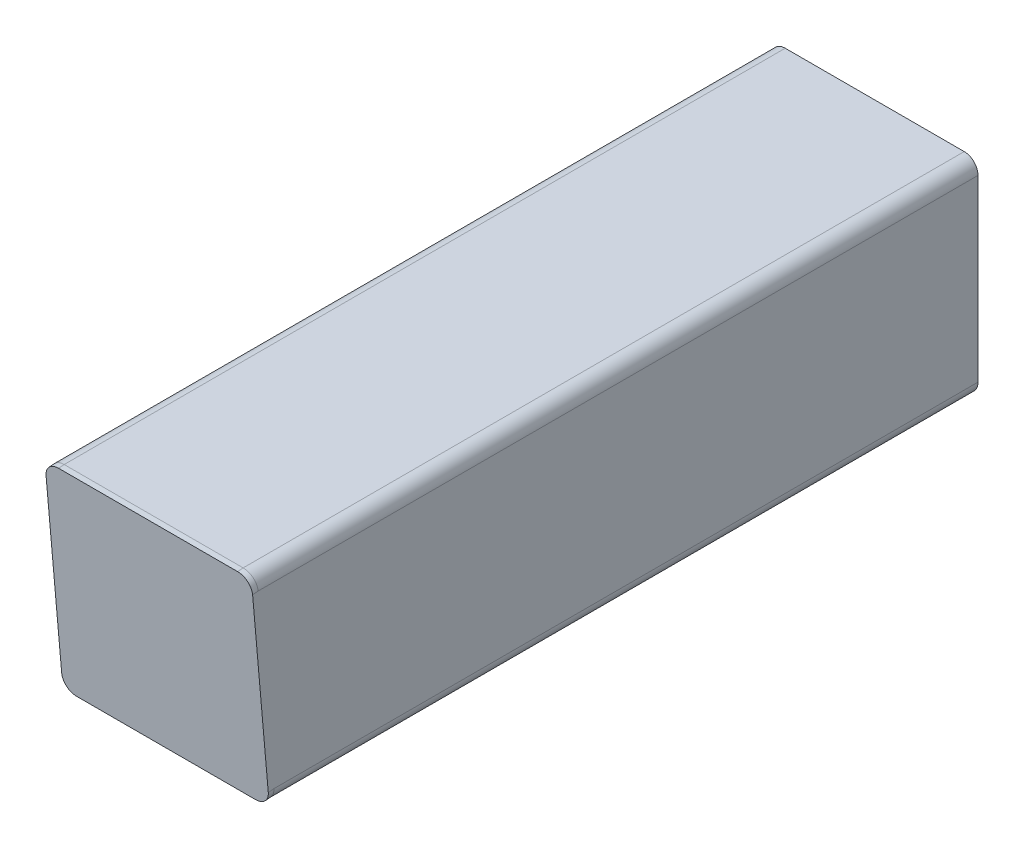
ISO-10303-21;
HEADER;
FILE_DESCRIPTION(('STEP AP214'),'2;1');
FILE_NAME('part.step','',(''),(''),'','','');
FILE_SCHEMA(('AUTOMOTIVE_DESIGN { 1 0 10303 214 1 1 1 1 }'));
ENDSEC;
DATA;
#1=APPLICATION_CONTEXT('core data for automotive mechanical design processes');
#2=APPLICATION_PROTOCOL_DEFINITION('international standard','automotive_design',2000,#1);
#3=PRODUCT_CONTEXT('',#1,'mechanical');
#4=PRODUCT('Part','Part','',(#3));
#5=PRODUCT_RELATED_PRODUCT_CATEGORY('part','',(#4));
#6=PRODUCT_DEFINITION_FORMATION('','',#4);
#7=PRODUCT_DEFINITION_CONTEXT('part definition',#1,'design');
#8=PRODUCT_DEFINITION('design','',#6,#7);
#9=PRODUCT_DEFINITION_SHAPE('','',#8);
#10=(LENGTH_UNIT() NAMED_UNIT(*) SI_UNIT(.MILLI.,.METRE.));
#11=(NAMED_UNIT(*) PLANE_ANGLE_UNIT() SI_UNIT($,.RADIAN.));
#12=(NAMED_UNIT(*) SI_UNIT($,.STERADIAN.) SOLID_ANGLE_UNIT());
#13=UNCERTAINTY_MEASURE_WITH_UNIT(LENGTH_MEASURE(1.E-05),#10,'distance_accuracy_value','');
#14=(GEOMETRIC_REPRESENTATION_CONTEXT(3) GLOBAL_UNCERTAINTY_ASSIGNED_CONTEXT((#13)) GLOBAL_UNIT_ASSIGNED_CONTEXT((#10,
#11,#12)) REPRESENTATION_CONTEXT('',''));
#15=CARTESIAN_POINT('',(0.,0.,0.));
#16=DIRECTION('',(0.,0.,1.));
#17=DIRECTION('',(1.,0.,0.));
#18=AXIS2_PLACEMENT_3D('',#15,#16,#17);
#19=CARTESIAN_POINT('',(2.54,-35.56,0.));
#20=DIRECTION('',(0.,0.,1.));
#21=DIRECTION('',(1.,0.,0.));
#22=AXIS2_PLACEMENT_3D('',#19,#20,#21);
#23=PLANE('',#22);
#24=CARTESIAN_POINT('',(2.54,-35.56,0.));
#25=DIRECTION('',(0.,0.,1.));
#26=DIRECTION('',(1.,0.,0.));
#27=AXIS2_PLACEMENT_3D('',#24,#25,#26);
#28=CIRCLE('',#27,2.54);
#29=CARTESIAN_POINT('',(0.,-35.56,0.));
#30=VERTEX_POINT('',#29);
#31=CARTESIAN_POINT('',(2.54000000000002,-38.1,0.));
#32=VERTEX_POINT('',#31);
#33=EDGE_CURVE('E358',#30,#32,#28,.T.);
#34=ORIENTED_EDGE('',*,*,#33,.F.);
#35=DIRECTION('',(0.,-1.,0.));
#36=VECTOR('',#35,1.);
#37=CARTESIAN_POINT('',(0.,-2.54000000000002,0.));
#38=LINE('',#37,#36);
#39=CARTESIAN_POINT('',(0.,-2.54000000000002,0.));
#40=VERTEX_POINT('',#39);
#41=EDGE_CURVE('E342',#40,#30,#38,.T.);
#42=ORIENTED_EDGE('',*,*,#41,.F.);
#43=CARTESIAN_POINT('',(2.54,-2.54,0.));
#44=DIRECTION('',(0.,0.,1.));
#45=DIRECTION('',(-1.,0.,0.));
#46=AXIS2_PLACEMENT_3D('',#43,#44,#45);
#47=CIRCLE('',#46,2.54);
#48=CARTESIAN_POINT('',(2.54000000000002,0.,0.));
#49=VERTEX_POINT('',#48);
#50=EDGE_CURVE('E345',#49,#40,#47,.T.);
#51=ORIENTED_EDGE('',*,*,#50,.F.);
#52=DIRECTION('',(-1.,0.,0.));
#53=VECTOR('',#52,1.);
#54=CARTESIAN_POINT('',(2.54000000000002,0.,0.));
#55=LINE('',#54,#53);
#56=CARTESIAN_POINT('',(35.56,0.,0.));
#57=VERTEX_POINT('',#56);
#58=EDGE_CURVE('E348',#57,#49,#55,.T.);
#59=ORIENTED_EDGE('',*,*,#58,.F.);
#60=CARTESIAN_POINT('',(35.56,-2.54,0.));
#61=DIRECTION('',(0.,0.,1.));
#62=DIRECTION('',(1.,0.,0.));
#63=AXIS2_PLACEMENT_3D('',#60,#61,#62);
#64=CIRCLE('',#63,2.54);
#65=CARTESIAN_POINT('',(38.1,-2.54000000000002,0.));
#66=VERTEX_POINT('',#65);
#67=EDGE_CURVE('E350',#66,#57,#64,.T.);
#68=ORIENTED_EDGE('',*,*,#67,.F.);
#69=DIRECTION('',(0.,1.,0.));
#70=VECTOR('',#69,1.);
#71=CARTESIAN_POINT('',(38.1,-2.54000000000002,0.));
#72=LINE('',#71,#70);
#73=CARTESIAN_POINT('',(38.1,-35.56,0.));
#74=VERTEX_POINT('',#73);
#75=EDGE_CURVE('E352',#74,#66,#72,.T.);
#76=ORIENTED_EDGE('',*,*,#75,.F.);
#77=CARTESIAN_POINT('',(35.56,-35.56,0.));
#78=DIRECTION('',(0.,0.,1.));
#79=DIRECTION('',(-1.,0.,0.));
#80=AXIS2_PLACEMENT_3D('',#77,#78,#79);
#81=CIRCLE('',#80,2.54);
#82=CARTESIAN_POINT('',(35.56,-38.1,0.));
#83=VERTEX_POINT('',#82);
#84=EDGE_CURVE('E355',#83,#74,#81,.T.);
#85=ORIENTED_EDGE('',*,*,#84,.F.);
#86=DIRECTION('',(1.,0.,0.));
#87=VECTOR('',#86,1.);
#88=CARTESIAN_POINT('',(2.54000000000002,-38.1,0.));
#89=LINE('',#88,#87);
#90=EDGE_CURVE('E321',#32,#83,#89,.T.);
#91=ORIENTED_EDGE('',*,*,#90,.F.);
#92=EDGE_LOOP('',(#34,#42,#51,#59,#68,#76,#85,#91));
#93=FACE_BOUND('',#92,.T.);
#94=CARTESIAN_POINT('',(5.3086,-32.7914,0.));
#95=DIRECTION('',(0.,0.,1.));
#96=DIRECTION('',(1.,0.,0.));
#97=AXIS2_PLACEMENT_3D('',#94,#95,#96);
#98=CIRCLE('',#97,2.54);
#99=CARTESIAN_POINT('',(2.7686,-32.7914,0.));
#100=VERTEX_POINT('',#99);
#101=CARTESIAN_POINT('',(5.30860000000002,-35.3314,0.));
#102=VERTEX_POINT('',#101);
#103=EDGE_CURVE('E400',#100,#102,#98,.T.);
#104=ORIENTED_EDGE('',*,*,#103,.T.);
#105=DIRECTION('',(1.,0.,0.));
#106=VECTOR('',#105,1.);
#107=CARTESIAN_POINT('',(5.30860000000002,-35.3314,0.));
#108=LINE('',#107,#106);
#109=CARTESIAN_POINT('',(32.7914,-35.3314,0.));
#110=VERTEX_POINT('',#109);
#111=EDGE_CURVE('E397',#102,#110,#108,.T.);
#112=ORIENTED_EDGE('',*,*,#111,.T.);
#113=CARTESIAN_POINT('',(32.7914,-32.7914,0.));
#114=DIRECTION('',(0.,0.,1.));
#115=DIRECTION('',(1.,0.,0.));
#116=AXIS2_PLACEMENT_3D('',#113,#114,#115);
#117=CIRCLE('',#116,2.54);
#118=CARTESIAN_POINT('',(35.3314,-32.7914,0.));
#119=VERTEX_POINT('',#118);
#120=EDGE_CURVE('E394',#110,#119,#117,.T.);
#121=ORIENTED_EDGE('',*,*,#120,.T.);
#122=DIRECTION('',(0.,1.,0.));
#123=VECTOR('',#122,1.);
#124=CARTESIAN_POINT('',(35.3314,-5.30860000000002,0.));
#125=LINE('',#124,#123);
#126=CARTESIAN_POINT('',(35.3314,-5.30860000000002,0.));
#127=VERTEX_POINT('',#126);
#128=EDGE_CURVE('E391',#119,#127,#125,.T.);
#129=ORIENTED_EDGE('',*,*,#128,.T.);
#130=CARTESIAN_POINT('',(32.7914,-5.3086,0.));
#131=DIRECTION('',(0.,0.,1.));
#132=DIRECTION('',(1.,0.,0.));
#133=AXIS2_PLACEMENT_3D('',#130,#131,#132);
#134=CIRCLE('',#133,2.54);
#135=CARTESIAN_POINT('',(32.7914,-2.7686,0.));
#136=VERTEX_POINT('',#135);
#137=EDGE_CURVE('E388',#127,#136,#134,.T.);
#138=ORIENTED_EDGE('',*,*,#137,.T.);
#139=DIRECTION('',(-1.,0.,0.));
#140=VECTOR('',#139,1.);
#141=CARTESIAN_POINT('',(5.30860000000002,-2.7686,0.));
#142=LINE('',#141,#140);
#143=CARTESIAN_POINT('',(5.30860000000002,-2.7686,0.));
#144=VERTEX_POINT('',#143);
#145=EDGE_CURVE('E385',#136,#144,#142,.T.);
#146=ORIENTED_EDGE('',*,*,#145,.T.);
#147=CARTESIAN_POINT('',(5.3086,-5.3086,0.));
#148=DIRECTION('',(0.,0.,1.));
#149=DIRECTION('',(1.,0.,0.));
#150=AXIS2_PLACEMENT_3D('',#147,#148,#149);
#151=CIRCLE('',#150,2.54);
#152=CARTESIAN_POINT('',(2.7686,-5.30860000000002,0.));
#153=VERTEX_POINT('',#152);
#154=EDGE_CURVE('E382',#144,#153,#151,.T.);
#155=ORIENTED_EDGE('',*,*,#154,.T.);
#156=DIRECTION('',(0.,-1.,0.));
#157=VECTOR('',#156,1.);
#158=CARTESIAN_POINT('',(2.7686,-5.30860000000002,0.));
#159=LINE('',#158,#157);
#160=EDGE_CURVE('E379',#153,#100,#159,.T.);
#161=ORIENTED_EDGE('',*,*,#160,.T.);
#162=EDGE_LOOP('',(#104,#112,#121,#129,#138,#146,#155,#161));
#163=FACE_BOUND('',#162,.T.);
#164=ADVANCED_FACE('F33',(#93,#163),#23,.F.);
#165=CARTESIAN_POINT('',(2.54,-35.56,133.));
#166=DIRECTION('',(0.,0.,-1.));
#167=DIRECTION('',(-1.,0.,0.));
#168=AXIS2_PLACEMENT_3D('',#165,#166,#167);
#169=CYLINDRICAL_SURFACE('',#168,2.54);
#170=DIRECTION('',(0.,0.,-1.));
#171=VECTOR('',#170,1.);
#172=CARTESIAN_POINT('',(2.54000000000002,-38.1,133.));
#173=LINE('',#172,#171);
#174=CARTESIAN_POINT('',(2.54000000000002,-38.1,129.666681919663));
#175=VERTEX_POINT('',#174);
#176=EDGE_CURVE('E41',#175,#32,#173,.T.);
#177=ORIENTED_EDGE('',*,*,#176,.F.);
#178=CARTESIAN_POINT('',(2.54,-35.56,129.888903125018));
#179=DIRECTION('',(0.,0.0871557427476518,-0.996194698091746));
#180=DIRECTION('',(0.,-0.996194698091746,-0.0871557427476518));
#181=AXIS2_PLACEMENT_3D('',#178,#179,#180);
#182=ELLIPSE('',#181,2.5497023873601,2.54);
#183=CARTESIAN_POINT('',(0.,-35.56,129.888903125018));
#184=VERTEX_POINT('',#183);
#185=EDGE_CURVE('E403',#175,#184,#182,.T.);
#186=ORIENTED_EDGE('',*,*,#185,.T.);
#187=DIRECTION('',(0.,0.,-1.));
#188=VECTOR('',#187,1.);
#189=CARTESIAN_POINT('',(0.,-35.56,133.));
#190=LINE('',#189,#188);
#191=EDGE_CURVE('E339',#184,#30,#190,.T.);
#192=ORIENTED_EDGE('',*,*,#191,.T.);
#193=ORIENTED_EDGE('',*,*,#33,.T.);
#194=EDGE_LOOP('',(#177,#186,#192,#193));
#195=FACE_BOUND('',#194,.T.);
#196=ADVANCED_FACE('F35',(#195),#169,.T.);
#197=CARTESIAN_POINT('',(2.54000000000002,-38.1,133.));
#198=DIRECTION('',(0.,1.,0.));
#199=DIRECTION('',(0.,0.,1.));
#200=AXIS2_PLACEMENT_3D('',#197,#198,#199);
#201=PLANE('',#200);
#202=DIRECTION('',(0.,0.,-1.));
#203=VECTOR('',#202,1.);
#204=CARTESIAN_POINT('',(35.56,-38.1,133.));
#205=LINE('',#204,#203);
#206=CARTESIAN_POINT('',(35.56,-38.1,129.666681919663));
#207=VERTEX_POINT('',#206);
#208=EDGE_CURVE('E318',#207,#83,#205,.T.);
#209=ORIENTED_EDGE('',*,*,#208,.F.);
#210=DIRECTION('',(1.,0.,0.));
#211=VECTOR('',#210,1.);
#212=CARTESIAN_POINT('',(0.,-38.1,129.666681919663));
#213=LINE('',#212,#211);
#214=EDGE_CURVE('E189',#175,#207,#213,.T.);
#215=ORIENTED_EDGE('',*,*,#214,.F.);
#216=ORIENTED_EDGE('',*,*,#176,.T.);
#217=ORIENTED_EDGE('',*,*,#90,.T.);
#218=EDGE_LOOP('',(#209,#215,#216,#217));
#219=FACE_BOUND('',#218,.T.);
#220=ADVANCED_FACE('F307',(#219),#201,.F.);
#221=CARTESIAN_POINT('',(35.56,-35.56,133.));
#222=DIRECTION('',(0.,0.,-1.));
#223=DIRECTION('',(-1.,0.,0.));
#224=AXIS2_PLACEMENT_3D('',#221,#222,#223);
#225=CYLINDRICAL_SURFACE('',#224,2.54);
#226=DIRECTION('',(0.,0.,-1.));
#227=VECTOR('',#226,1.);
#228=CARTESIAN_POINT('',(38.1,-35.56,133.));
#229=LINE('',#228,#227);
#230=CARTESIAN_POINT('',(38.1,-35.56,129.888903125018));
#231=VERTEX_POINT('',#230);
#232=EDGE_CURVE('E325',#231,#74,#229,.T.);
#233=ORIENTED_EDGE('',*,*,#232,.F.);
#234=CARTESIAN_POINT('',(35.56,-35.56,129.888903125018));
#235=DIRECTION('',(0.,0.0871557427476518,-0.996194698091746));
#236=DIRECTION('',(0.,-0.996194698091746,-0.0871557427476518));
#237=AXIS2_PLACEMENT_3D('',#234,#235,#236);
#238=ELLIPSE('',#237,2.5497023873601,2.54);
#239=EDGE_CURVE('E406',#231,#207,#238,.T.);
#240=ORIENTED_EDGE('',*,*,#239,.T.);
#241=ORIENTED_EDGE('',*,*,#208,.T.);
#242=ORIENTED_EDGE('',*,*,#84,.T.);
#243=EDGE_LOOP('',(#233,#240,#241,#242));
#244=FACE_BOUND('',#243,.T.);
#245=ADVANCED_FACE('F304',(#244),#225,.T.);
#246=CARTESIAN_POINT('',(38.1,-2.54000000000002,133.));
#247=DIRECTION('',(-1.,0.,0.));
#248=DIRECTION('',(0.,-1.,0.));
#249=AXIS2_PLACEMENT_3D('',#246,#247,#248);
#250=PLANE('',#249);
#251=DIRECTION('',(0.,0.,-1.));
#252=VECTOR('',#251,1.);
#253=CARTESIAN_POINT('',(38.1,-2.54000000000002,133.));
#254=LINE('',#253,#252);
#255=CARTESIAN_POINT('',(38.1,-2.54000000000001,132.777778794644));
#256=VERTEX_POINT('',#255);
#257=EDGE_CURVE('E327',#256,#66,#254,.T.);
#258=ORIENTED_EDGE('',*,*,#257,.F.);
#259=DIRECTION('',(0.,0.0871557427476518,-0.996194698091746));
#260=VECTOR('',#259,1.);
#261=CARTESIAN_POINT('',(38.1,-7.33415083272136,187.57517355998));
#262=LINE('',#261,#260);
#263=CARTESIAN_POINT('',(38.1,-2.62908778854354,133.796056877234));
#264=VERTEX_POINT('',#263);
#265=EDGE_CURVE('E214',#264,#256,#262,.T.);
#266=ORIENTED_EDGE('',*,*,#265,.F.);
#267=DIRECTION('',(0.,0.996194698091746,0.0871557427476584));
#268=VECTOR('',#267,1.);
#269=CARTESIAN_POINT('',(38.1,-35.6490877885443,130.907181207621));
#270=LINE('',#269,#268);
#271=CARTESIAN_POINT('',(38.1,-35.6490877885446,130.907181207621));
#272=VERTEX_POINT('',#271);
#273=EDGE_CURVE('E198',#272,#264,#270,.T.);
#274=ORIENTED_EDGE('',*,*,#273,.F.);
#275=DIRECTION('',(0.,0.0871557427476518,-0.996194698091746));
#276=VECTOR('',#275,1.);
#277=CARTESIAN_POINT('',(38.1,-40.3541508327214,184.686297890354));
#278=LINE('',#277,#276);
#279=EDGE_CURVE('E212',#272,#231,#278,.T.);
#280=ORIENTED_EDGE('',*,*,#279,.T.);
#281=ORIENTED_EDGE('',*,*,#232,.T.);
#282=ORIENTED_EDGE('',*,*,#75,.T.);
#283=EDGE_LOOP('',(#258,#266,#274,#280,#281,#282));
#284=FACE_BOUND('',#283,.T.);
#285=ADVANCED_FACE('F300',(#284),#250,.F.);
#286=CARTESIAN_POINT('',(35.56,-2.54,133.));
#287=DIRECTION('',(0.,0.,-1.));
#288=DIRECTION('',(-1.,0.,0.));
#289=AXIS2_PLACEMENT_3D('',#286,#287,#288);
#290=CYLINDRICAL_SURFACE('',#289,2.54);
#291=DIRECTION('',(0.,0.,-1.));
#292=VECTOR('',#291,1.);
#293=CARTESIAN_POINT('',(35.56,0.,133.));
#294=LINE('',#293,#292);
#295=CARTESIAN_POINT('',(35.56,0.,133.));
#296=VERTEX_POINT('',#295);
#297=EDGE_CURVE('E331',#296,#57,#294,.T.);
#298=ORIENTED_EDGE('',*,*,#297,.F.);
#299=CARTESIAN_POINT('',(35.56,-2.54,132.777778794644));
#300=DIRECTION('',(0.,0.0871557427476518,-0.996194698091746));
#301=DIRECTION('',(0.,-0.996194698091746,-0.0871557427476518));
#302=AXIS2_PLACEMENT_3D('',#299,#300,#301);
#303=ELLIPSE('',#302,2.5497023873601,2.54);
#304=EDGE_CURVE('E408',#296,#256,#303,.T.);
#305=ORIENTED_EDGE('',*,*,#304,.T.);
#306=ORIENTED_EDGE('',*,*,#257,.T.);
#307=ORIENTED_EDGE('',*,*,#67,.T.);
#308=EDGE_LOOP('',(#298,#305,#306,#307));
#309=FACE_BOUND('',#308,.T.);
#310=ADVANCED_FACE('F296',(#309),#290,.T.);
#311=CARTESIAN_POINT('',(2.54000000000002,0.,133.));
#312=DIRECTION('',(0.,-1.,0.));
#313=DIRECTION('',(0.,0.,-1.));
#314=AXIS2_PLACEMENT_3D('',#311,#312,#313);
#315=PLANE('',#314);
#316=ORIENTED_EDGE('',*,*,#58,.T.);
#317=DIRECTION('',(0.,0.,-1.));
#318=VECTOR('',#317,1.);
#319=CARTESIAN_POINT('',(2.54000000000002,0.,133.));
#320=LINE('',#319,#318);
#321=CARTESIAN_POINT('',(2.54,0.,133.));
#322=VERTEX_POINT('',#321);
#323=EDGE_CURVE('E334',#322,#49,#320,.T.);
#324=ORIENTED_EDGE('',*,*,#323,.F.);
#325=DIRECTION('',(-1.,0.,0.));
#326=VECTOR('',#325,1.);
#327=CARTESIAN_POINT('',(2.54000000000002,0.,133.));
#328=LINE('',#327,#326);
#329=EDGE_CURVE('E341',#296,#322,#328,.T.);
#330=ORIENTED_EDGE('',*,*,#329,.F.);
#331=ORIENTED_EDGE('',*,*,#297,.T.);
#332=EDGE_LOOP('',(#316,#324,#330,#331));
#333=FACE_BOUND('',#332,.T.);
#334=ADVANCED_FACE('F292',(#333),#315,.F.);
#335=CARTESIAN_POINT('',(2.54,-2.54,133.));
#336=DIRECTION('',(0.,0.,-1.));
#337=DIRECTION('',(-1.,0.,0.));
#338=AXIS2_PLACEMENT_3D('',#335,#336,#337);
#339=CYLINDRICAL_SURFACE('',#338,2.54);
#340=DIRECTION('',(0.,0.,-1.));
#341=VECTOR('',#340,1.);
#342=CARTESIAN_POINT('',(0.,-2.54000000000002,133.));
#343=LINE('',#342,#341);
#344=CARTESIAN_POINT('',(0.,-2.54000000000002,132.777778794644));
#345=VERTEX_POINT('',#344);
#346=EDGE_CURVE('E337',#345,#40,#343,.T.);
#347=ORIENTED_EDGE('',*,*,#346,.F.);
#348=CARTESIAN_POINT('',(2.54,-2.54,132.777778794644));
#349=DIRECTION('',(0.,0.0871557427476518,-0.996194698091746));
#350=DIRECTION('',(0.,-0.996194698091746,-0.0871557427476518));
#351=AXIS2_PLACEMENT_3D('',#348,#349,#350);
#352=ELLIPSE('',#351,2.5497023873601,2.54);
#353=EDGE_CURVE('E48',#345,#322,#352,.T.);
#354=ORIENTED_EDGE('',*,*,#353,.T.);
#355=ORIENTED_EDGE('',*,*,#323,.T.);
#356=ORIENTED_EDGE('',*,*,#50,.T.);
#357=EDGE_LOOP('',(#347,#354,#355,#356));
#358=FACE_BOUND('',#357,.T.);
#359=ADVANCED_FACE('F289',(#358),#339,.T.);
#360=CARTESIAN_POINT('',(0.,-2.54000000000002,133.));
#361=DIRECTION('',(1.,0.,0.));
#362=DIRECTION('',(0.,1.,0.));
#363=AXIS2_PLACEMENT_3D('',#360,#361,#362);
#364=PLANE('',#363);
#365=ORIENTED_EDGE('',*,*,#191,.F.);
#366=DIRECTION('',(0.,0.0871557427476518,-0.996194698091746));
#367=VECTOR('',#366,1.);
#368=CARTESIAN_POINT('',(0.,-40.3541508327214,184.686297890354));
#369=LINE('',#368,#367);
#370=CARTESIAN_POINT('',(0.,-35.6490877885446,130.907181207621));
#371=VERTEX_POINT('',#370);
#372=EDGE_CURVE('E179',#371,#184,#369,.T.);
#373=ORIENTED_EDGE('',*,*,#372,.F.);
#374=DIRECTION('',(0.,-0.996194698091746,-0.0871557427476584));
#375=VECTOR('',#374,1.);
#376=CARTESIAN_POINT('',(0.,-2.62908778854432,133.796056877247));
#377=LINE('',#376,#375);
#378=CARTESIAN_POINT('',(0.,-2.62908778854468,133.796056877247));
#379=VERTEX_POINT('',#378);
#380=EDGE_CURVE('E173',#379,#371,#377,.T.);
#381=ORIENTED_EDGE('',*,*,#380,.F.);
#382=DIRECTION('',(0.,0.0871557427476518,-0.996194698091746));
#383=VECTOR('',#382,1.);
#384=CARTESIAN_POINT('',(0.,-7.33415083272137,187.57517355998));
#385=LINE('',#384,#383);
#386=EDGE_CURVE('E165',#379,#345,#385,.T.);
#387=ORIENTED_EDGE('',*,*,#386,.T.);
#388=ORIENTED_EDGE('',*,*,#346,.T.);
#389=ORIENTED_EDGE('',*,*,#41,.T.);
#390=EDGE_LOOP('',(#365,#373,#381,#387,#388,#389));
#391=FACE_BOUND('',#390,.T.);
#392=ADVANCED_FACE('F178',(#391),#364,.F.);
#393=CARTESIAN_POINT('',(5.3086,-32.7914,133.));
#394=DIRECTION('',(0.,0.,-1.));
#395=DIRECTION('',(-1.,0.,0.));
#396=AXIS2_PLACEMENT_3D('',#393,#394,#395);
#397=CYLINDRICAL_SURFACE('',#396,2.54);
#398=CARTESIAN_POINT('',(5.3086,-32.7914,130.131124238856));
#399=DIRECTION('',(0.,0.0871557427476518,-0.996194698091746));
#400=DIRECTION('',(0.,-0.996194698091746,-0.0871557427476518));
#401=AXIS2_PLACEMENT_3D('',#398,#399,#400);
#402=ELLIPSE('',#401,2.5497023873601,2.54);
#403=CARTESIAN_POINT('',(5.30860000000002,-35.3314,129.9089030335));
#404=VERTEX_POINT('',#403);
#405=CARTESIAN_POINT('',(2.7686,-32.7914,130.131124238856));
#406=VERTEX_POINT('',#405);
#407=EDGE_CURVE('E412',#404,#406,#402,.T.);
#408=ORIENTED_EDGE('',*,*,#407,.F.);
#409=DIRECTION('',(0.,0.,-1.));
#410=VECTOR('',#409,1.);
#411=CARTESIAN_POINT('',(5.30860000000002,-35.3314,133.));
#412=LINE('',#411,#410);
#413=EDGE_CURVE('E361',#404,#102,#412,.T.);
#414=ORIENTED_EDGE('',*,*,#413,.T.);
#415=ORIENTED_EDGE('',*,*,#103,.F.);
#416=DIRECTION('',(0.,0.,-1.));
#417=VECTOR('',#416,1.);
#418=CARTESIAN_POINT('',(2.7686,-32.7914,133.));
#419=LINE('',#418,#417);
#420=EDGE_CURVE('E377',#406,#100,#419,.T.);
#421=ORIENTED_EDGE('',*,*,#420,.F.);
#422=EDGE_LOOP('',(#408,#414,#415,#421));
#423=FACE_BOUND('',#422,.T.);
#424=ADVANCED_FACE('F279',(#423),#397,.F.);
#425=CARTESIAN_POINT('',(5.30860000000002,-35.3314,133.));
#426=DIRECTION('',(0.,1.,0.));
#427=DIRECTION('',(0.,0.,1.));
#428=AXIS2_PLACEMENT_3D('',#425,#426,#427);
#429=PLANE('',#428);
#430=DIRECTION('',(-1.,0.,0.));
#431=VECTOR('',#430,1.);
#432=CARTESIAN_POINT('',(5.30860000000002,-35.3314,129.9089030335));
#433=LINE('',#432,#431);
#434=CARTESIAN_POINT('',(32.7914,-35.3314,129.9089030335));
#435=VERTEX_POINT('',#434);
#436=EDGE_CURVE('E415',#435,#404,#433,.T.);
#437=ORIENTED_EDGE('',*,*,#436,.F.);
#438=DIRECTION('',(0.,0.,-1.));
#439=VECTOR('',#438,1.);
#440=CARTESIAN_POINT('',(32.7914,-35.3314,133.));
#441=LINE('',#440,#439);
#442=EDGE_CURVE('E365',#435,#110,#441,.T.);
#443=ORIENTED_EDGE('',*,*,#442,.T.);
#444=ORIENTED_EDGE('',*,*,#111,.F.);
#445=ORIENTED_EDGE('',*,*,#413,.F.);
#446=EDGE_LOOP('',(#437,#443,#444,#445));
#447=FACE_BOUND('',#446,.T.);
#448=ADVANCED_FACE('F275',(#447),#429,.T.);
#449=CARTESIAN_POINT('',(32.7914,-32.7914,133.));
#450=DIRECTION('',(0.,0.,-1.));
#451=DIRECTION('',(-1.,0.,0.));
#452=AXIS2_PLACEMENT_3D('',#449,#450,#451);
#453=CYLINDRICAL_SURFACE('',#452,2.54);
#454=CARTESIAN_POINT('',(32.7914,-32.7914,130.131124238856));
#455=DIRECTION('',(0.,0.0871557427476518,-0.996194698091746));
#456=DIRECTION('',(0.,-0.996194698091746,-0.0871557427476518));
#457=AXIS2_PLACEMENT_3D('',#454,#455,#456);
#458=ELLIPSE('',#457,2.5497023873601,2.54);
#459=CARTESIAN_POINT('',(35.3314,-32.7914,130.131124238856));
#460=VERTEX_POINT('',#459);
#461=EDGE_CURVE('E418',#460,#435,#458,.T.);
#462=ORIENTED_EDGE('',*,*,#461,.F.);
#463=DIRECTION('',(0.,0.,-1.));
#464=VECTOR('',#463,1.);
#465=CARTESIAN_POINT('',(35.3314,-32.7914,133.));
#466=LINE('',#465,#464);
#467=EDGE_CURVE('E367',#460,#119,#466,.T.);
#468=ORIENTED_EDGE('',*,*,#467,.T.);
#469=ORIENTED_EDGE('',*,*,#120,.F.);
#470=ORIENTED_EDGE('',*,*,#442,.F.);
#471=EDGE_LOOP('',(#462,#468,#469,#470));
#472=FACE_BOUND('',#471,.T.);
#473=ADVANCED_FACE('F271',(#472),#453,.F.);
#474=CARTESIAN_POINT('',(35.3314,-5.30860000000002,133.));
#475=DIRECTION('',(-1.,0.,0.));
#476=DIRECTION('',(0.,0.,1.));
#477=AXIS2_PLACEMENT_3D('',#474,#475,#476);
#478=PLANE('',#477);
#479=DIRECTION('',(0.,-0.996194698091746,-0.0871557427476518));
#480=VECTOR('',#479,1.);
#481=CARTESIAN_POINT('',(35.3314,-5.26827521882033,132.539085642019));
#482=LINE('',#481,#480);
#483=CARTESIAN_POINT('',(35.3314,-5.30860000000002,132.535557680806));
#484=VERTEX_POINT('',#483);
#485=EDGE_CURVE('E421',#484,#460,#482,.T.);
#486=ORIENTED_EDGE('',*,*,#485,.F.);
#487=DIRECTION('',(0.,0.,-1.));
#488=VECTOR('',#487,1.);
#489=CARTESIAN_POINT('',(35.3314,-5.30860000000002,133.));
#490=LINE('',#489,#488);
#491=EDGE_CURVE('E369',#484,#127,#490,.T.);
#492=ORIENTED_EDGE('',*,*,#491,.T.);
#493=ORIENTED_EDGE('',*,*,#128,.F.);
#494=ORIENTED_EDGE('',*,*,#467,.F.);
#495=EDGE_LOOP('',(#486,#492,#493,#494));
#496=FACE_BOUND('',#495,.T.);
#497=ADVANCED_FACE('F267',(#496),#478,.T.);
#498=CARTESIAN_POINT('',(32.7914,-5.3086,133.));
#499=DIRECTION('',(0.,0.,-1.));
#500=DIRECTION('',(-1.,0.,0.));
#501=AXIS2_PLACEMENT_3D('',#498,#499,#500);
#502=CYLINDRICAL_SURFACE('',#501,2.54);
#503=CARTESIAN_POINT('',(32.7914,-5.3086,132.535557680806));
#504=DIRECTION('',(0.,0.0871557427476518,-0.996194698091746));
#505=DIRECTION('',(0.,-0.996194698091746,-0.0871557427476518));
#506=AXIS2_PLACEMENT_3D('',#503,#504,#505);
#507=ELLIPSE('',#506,2.5497023873601,2.54);
#508=CARTESIAN_POINT('',(32.7914,-2.7686,132.757778886162));
#509=VERTEX_POINT('',#508);
#510=EDGE_CURVE('E424',#509,#484,#507,.T.);
#511=ORIENTED_EDGE('',*,*,#510,.F.);
#512=DIRECTION('',(0.,0.,-1.));
#513=VECTOR('',#512,1.);
#514=CARTESIAN_POINT('',(32.7914,-2.7686,133.));
#515=LINE('',#514,#513);
#516=EDGE_CURVE('E371',#509,#136,#515,.T.);
#517=ORIENTED_EDGE('',*,*,#516,.T.);
#518=ORIENTED_EDGE('',*,*,#137,.F.);
#519=ORIENTED_EDGE('',*,*,#491,.F.);
#520=EDGE_LOOP('',(#511,#517,#518,#519));
#521=FACE_BOUND('',#520,.T.);
#522=ADVANCED_FACE('F263',(#521),#502,.F.);
#523=CARTESIAN_POINT('',(5.30860000000002,-2.7686,133.));
#524=DIRECTION('',(0.,-1.,0.));
#525=DIRECTION('',(0.,0.,-1.));
#526=AXIS2_PLACEMENT_3D('',#523,#524,#525);
#527=PLANE('',#526);
#528=DIRECTION('',(1.,0.,0.));
#529=VECTOR('',#528,1.);
#530=CARTESIAN_POINT('',(5.30860000000002,-2.7686,132.757778886162));
#531=LINE('',#530,#529);
#532=CARTESIAN_POINT('',(5.30860000000002,-2.7686,132.757778886162));
#533=VERTEX_POINT('',#532);
#534=EDGE_CURVE('E427',#533,#509,#531,.T.);
#535=ORIENTED_EDGE('',*,*,#534,.F.);
#536=DIRECTION('',(0.,0.,-1.));
#537=VECTOR('',#536,1.);
#538=CARTESIAN_POINT('',(5.30860000000002,-2.7686,133.));
#539=LINE('',#538,#537);
#540=EDGE_CURVE('E373',#533,#144,#539,.T.);
#541=ORIENTED_EDGE('',*,*,#540,.T.);
#542=ORIENTED_EDGE('',*,*,#145,.F.);
#543=ORIENTED_EDGE('',*,*,#516,.F.);
#544=EDGE_LOOP('',(#535,#541,#542,#543));
#545=FACE_BOUND('',#544,.T.);
#546=ADVANCED_FACE('F259',(#545),#527,.T.);
#547=CARTESIAN_POINT('',(5.3086,-5.3086,133.));
#548=DIRECTION('',(0.,0.,-1.));
#549=DIRECTION('',(-1.,0.,0.));
#550=AXIS2_PLACEMENT_3D('',#547,#548,#549);
#551=CYLINDRICAL_SURFACE('',#550,2.54);
#552=CARTESIAN_POINT('',(5.3086,-5.3086,132.535557680806));
#553=DIRECTION('',(0.,0.0871557427476518,-0.996194698091746));
#554=DIRECTION('',(0.,-0.996194698091746,-0.0871557427476518));
#555=AXIS2_PLACEMENT_3D('',#552,#553,#554);
#556=ELLIPSE('',#555,2.5497023873601,2.54);
#557=CARTESIAN_POINT('',(2.7686,-5.30860000000002,132.535557680806));
#558=VERTEX_POINT('',#557);
#559=EDGE_CURVE('E192',#558,#533,#556,.T.);
#560=ORIENTED_EDGE('',*,*,#559,.F.);
#561=DIRECTION('',(0.,0.,-1.));
#562=VECTOR('',#561,1.);
#563=CARTESIAN_POINT('',(2.7686,-5.30860000000002,133.));
#564=LINE('',#563,#562);
#565=EDGE_CURVE('E375',#558,#153,#564,.T.);
#566=ORIENTED_EDGE('',*,*,#565,.T.);
#567=ORIENTED_EDGE('',*,*,#154,.F.);
#568=ORIENTED_EDGE('',*,*,#540,.F.);
#569=EDGE_LOOP('',(#560,#566,#567,#568));
#570=FACE_BOUND('',#569,.T.);
#571=ADVANCED_FACE('F256',(#570),#551,.F.);
#572=CARTESIAN_POINT('',(2.7686,-5.30860000000002,133.));
#573=DIRECTION('',(1.,0.,0.));
#574=DIRECTION('',(0.,0.,-1.));
#575=AXIS2_PLACEMENT_3D('',#572,#573,#574);
#576=PLANE('',#575);
#577=DIRECTION('',(0.,0.996194698091746,0.0871557427476518));
#578=VECTOR('',#577,1.);
#579=CARTESIAN_POINT('',(2.7686,-5.26827521882033,132.539085642019));
#580=LINE('',#579,#578);
#581=EDGE_CURVE('E11',#406,#558,#580,.T.);
#582=ORIENTED_EDGE('',*,*,#581,.F.);
#583=ORIENTED_EDGE('',*,*,#420,.T.);
#584=ORIENTED_EDGE('',*,*,#160,.F.);
#585=ORIENTED_EDGE('',*,*,#565,.F.);
#586=EDGE_LOOP('',(#582,#583,#584,#585));
#587=FACE_BOUND('',#586,.T.);
#588=ADVANCED_FACE('F253',(#587),#576,.T.);
#589=CARTESIAN_POINT('',(2.53999999994667,-1965.75285666004,-37.9550179972954));
#590=DIRECTION('',(0.,-0.0871557427476584,0.996194698091746));
#591=DIRECTION('',(0.,-0.996194698091746,-0.0871557427476584));
#592=AXIS2_PLACEMENT_3D('',#589,#590,#591);
#593=PLANE('',#592);
#594=ORIENTED_EDGE('',*,*,#380,.T.);
#595=CARTESIAN_POINT('',(2.54000000000001,-35.6490877885435,130.907181207608));
#596=DIRECTION('',(0.,-0.0871557427476519,0.996194698091746));
#597=DIRECTION('',(0.,-0.996194698091746,-0.0871557427476519));
#598=AXIS2_PLACEMENT_3D('',#595,#596,#597);
#599=ELLIPSE('',#598,2.5497023873601,2.54);
#600=CARTESIAN_POINT('',(2.54000000000002,-38.1890877885447,130.684960002265));
#601=VERTEX_POINT('',#600);
#602=EDGE_CURVE('E183',#371,#601,#599,.T.);
#603=ORIENTED_EDGE('',*,*,#602,.T.);
#604=DIRECTION('',(1.,0.,0.));
#605=VECTOR('',#604,1.);
#606=CARTESIAN_POINT('',(2.54000000000001,-38.1890877885447,130.684960002265));
#607=LINE('',#606,#605);
#608=CARTESIAN_POINT('',(35.56,-38.1890877885436,130.684960002253));
#609=VERTEX_POINT('',#608);
#610=EDGE_CURVE('E204',#601,#609,#607,.T.);
#611=ORIENTED_EDGE('',*,*,#610,.T.);
#612=CARTESIAN_POINT('',(35.56,-35.6490877885435,130.907181207608));
#613=DIRECTION('',(0.,-0.0871557427476519,0.996194698091746));
#614=DIRECTION('',(0.,-0.996194698091746,-0.0871557427476519));
#615=AXIS2_PLACEMENT_3D('',#612,#613,#614);
#616=ELLIPSE('',#615,2.5497023873601,2.54);
#617=EDGE_CURVE('E201',#609,#272,#616,.T.);
#618=ORIENTED_EDGE('',*,*,#617,.T.);
#619=ORIENTED_EDGE('',*,*,#273,.T.);
#620=CARTESIAN_POINT('',(35.56,-2.62908778854354,133.796056877234));
#621=DIRECTION('',(0.,-0.0871557427476519,0.996194698091746));
#622=DIRECTION('',(0.,-0.996194698091746,-0.0871557427476519));
#623=AXIS2_PLACEMENT_3D('',#620,#621,#622);
#624=ELLIPSE('',#623,2.5497023873601,2.54);
#625=CARTESIAN_POINT('',(35.56,-0.0890877885446626,134.018278082603));
#626=VERTEX_POINT('',#625);
#627=EDGE_CURVE('E194',#264,#626,#624,.T.);
#628=ORIENTED_EDGE('',*,*,#627,.T.);
#629=DIRECTION('',(-1.,0.,0.));
#630=VECTOR('',#629,1.);
#631=CARTESIAN_POINT('',(35.56,-0.0890877885446634,134.018278082603));
#632=LINE('',#631,#630);
#633=CARTESIAN_POINT('',(2.54,-0.089087788543535,134.01827808259));
#634=VERTEX_POINT('',#633);
#635=EDGE_CURVE('E188',#626,#634,#632,.T.);
#636=ORIENTED_EDGE('',*,*,#635,.T.);
#637=CARTESIAN_POINT('',(2.54,-2.62908778854354,133.796056877234));
#638=DIRECTION('',(0.,-0.0871557427476519,0.996194698091746));
#639=DIRECTION('',(0.,-0.996194698091746,-0.0871557427476519));
#640=AXIS2_PLACEMENT_3D('',#637,#638,#639);
#641=ELLIPSE('',#640,2.5497023873601,2.54);
#642=EDGE_CURVE('E169',#634,#379,#641,.T.);
#643=ORIENTED_EDGE('',*,*,#642,.T.);
#644=EDGE_LOOP('',(#594,#603,#611,#618,#619,#628,#636,#643));
#645=FACE_BOUND('',#644,.T.);
#646=ADVANCED_FACE('F186',(#645),#593,.T.);
#647=CARTESIAN_POINT('',(2.54,-7.33415083272136,187.57517355998));
#648=DIRECTION('',(0.,-0.0871557427476519,0.996194698091746));
#649=DIRECTION('',(0.,-0.996194698091746,-0.0871557427476519));
#650=AXIS2_PLACEMENT_3D('',#647,#648,#649);
#651=ELLIPSE('',#650,2.5497023873601,2.54);
#652=DIRECTION('',(0.,0.0871557427476518,-0.996194698091746));
#653=VECTOR('',#652,1.);
#654=SURFACE_OF_LINEAR_EXTRUSION('',#651,#653);
#655=ORIENTED_EDGE('',*,*,#642,.F.);
#656=DIRECTION('',(0.,0.0871557427476518,-0.996194698091746));
#657=VECTOR('',#656,1.);
#658=CARTESIAN_POINT('',(2.54,-4.79415083272136,187.797394765336));
#659=LINE('',#658,#657);
#660=EDGE_CURVE('E174',#634,#322,#659,.T.);
#661=ORIENTED_EDGE('',*,*,#660,.T.);
#662=ORIENTED_EDGE('',*,*,#353,.F.);
#663=ORIENTED_EDGE('',*,*,#386,.F.);
#664=EDGE_LOOP('',(#655,#661,#662,#663));
#665=FACE_BOUND('',#664,.T.);
#666=ADVANCED_FACE('F167',(#665),#654,.F.);
#667=CARTESIAN_POINT('',(35.56,-4.79415083272136,187.797394765336));
#668=DIRECTION('',(0.,-0.996194698091746,-0.0871557427476518));
#669=DIRECTION('',(0.,0.0871557427476518,-0.996194698091746));
#670=AXIS2_PLACEMENT_3D('',#667,#668,#669);
#671=PLANE('',#670);
#672=ORIENTED_EDGE('',*,*,#635,.F.);
#673=DIRECTION('',(0.,0.0871557427476518,-0.996194698091746));
#674=VECTOR('',#673,1.);
#675=CARTESIAN_POINT('',(35.56,-4.79415083272136,187.797394765336));
#676=LINE('',#675,#674);
#677=EDGE_CURVE('E216',#626,#296,#676,.T.);
#678=ORIENTED_EDGE('',*,*,#677,.T.);
#679=ORIENTED_EDGE('',*,*,#329,.T.);
#680=ORIENTED_EDGE('',*,*,#660,.F.);
#681=EDGE_LOOP('',(#672,#678,#679,#680));
#682=FACE_BOUND('',#681,.T.);
#683=ADVANCED_FACE('F228',(#682),#671,.F.);
#684=CARTESIAN_POINT('',(35.56,-7.33415083272136,187.57517355998));
#685=DIRECTION('',(0.,-0.0871557427476519,0.996194698091746));
#686=DIRECTION('',(0.,-0.996194698091746,-0.0871557427476519));
#687=AXIS2_PLACEMENT_3D('',#684,#685,#686);
#688=ELLIPSE('',#687,2.5497023873601,2.54);
#689=DIRECTION('',(0.,0.0871557427476518,-0.996194698091746));
#690=VECTOR('',#689,1.);
#691=SURFACE_OF_LINEAR_EXTRUSION('',#688,#690);
#692=ORIENTED_EDGE('',*,*,#627,.F.);
#693=ORIENTED_EDGE('',*,*,#265,.T.);
#694=ORIENTED_EDGE('',*,*,#304,.F.);
#695=ORIENTED_EDGE('',*,*,#677,.F.);
#696=EDGE_LOOP('',(#692,#693,#694,#695));
#697=FACE_BOUND('',#696,.T.);
#698=ADVANCED_FACE('F232',(#697),#691,.F.);
#699=CARTESIAN_POINT('',(35.56,-40.3541508327214,184.686297890354));
#700=DIRECTION('',(0.,-0.0871557427476519,0.996194698091746));
#701=DIRECTION('',(0.,-0.996194698091746,-0.0871557427476519));
#702=AXIS2_PLACEMENT_3D('',#699,#700,#701);
#703=ELLIPSE('',#702,2.5497023873601,2.54);
#704=DIRECTION('',(0.,0.0871557427476518,-0.996194698091746));
#705=VECTOR('',#704,1.);
#706=SURFACE_OF_LINEAR_EXTRUSION('',#703,#705);
#707=ORIENTED_EDGE('',*,*,#617,.F.);
#708=DIRECTION('',(0.,0.0871557427476518,-0.996194698091746));
#709=VECTOR('',#708,1.);
#710=CARTESIAN_POINT('',(35.56,-42.8941508327214,184.464076684999));
#711=LINE('',#710,#709);
#712=EDGE_CURVE('E210',#609,#207,#711,.T.);
#713=ORIENTED_EDGE('',*,*,#712,.T.);
#714=ORIENTED_EDGE('',*,*,#239,.F.);
#715=ORIENTED_EDGE('',*,*,#279,.F.);
#716=EDGE_LOOP('',(#707,#713,#714,#715));
#717=FACE_BOUND('',#716,.T.);
#718=ADVANCED_FACE('F236',(#717),#706,.F.);
#719=CARTESIAN_POINT('',(2.54000000000002,-42.8941508327214,184.464076684999));
#720=DIRECTION('',(0.,0.996194698091746,0.0871557427476518));
#721=DIRECTION('',(0.,-0.0871557427476518,0.996194698091746));
#722=AXIS2_PLACEMENT_3D('',#719,#720,#721);
#723=PLANE('',#722);
#724=ORIENTED_EDGE('',*,*,#610,.F.);
#725=DIRECTION('',(0.,0.0871557427476518,-0.996194698091746));
#726=VECTOR('',#725,1.);
#727=CARTESIAN_POINT('',(2.54000000000002,-42.8941508327214,184.464076684999));
#728=LINE('',#727,#726);
#729=EDGE_CURVE('E208',#601,#175,#728,.T.);
#730=ORIENTED_EDGE('',*,*,#729,.T.);
#731=ORIENTED_EDGE('',*,*,#214,.T.);
#732=ORIENTED_EDGE('',*,*,#712,.F.);
#733=EDGE_LOOP('',(#724,#730,#731,#732));
#734=FACE_BOUND('',#733,.T.);
#735=ADVANCED_FACE('F240',(#734),#723,.F.);
#736=CARTESIAN_POINT('',(2.54000000000001,-40.3541508327214,184.686297890354));
#737=DIRECTION('',(0.,-0.0871557427476519,0.996194698091746));
#738=DIRECTION('',(0.,-0.996194698091746,-0.0871557427476519));
#739=AXIS2_PLACEMENT_3D('',#736,#737,#738);
#740=ELLIPSE('',#739,2.5497023873601,2.54);
#741=DIRECTION('',(0.,0.0871557427476518,-0.996194698091746));
#742=VECTOR('',#741,1.);
#743=SURFACE_OF_LINEAR_EXTRUSION('',#740,#742);
#744=ORIENTED_EDGE('',*,*,#602,.F.);
#745=ORIENTED_EDGE('',*,*,#372,.T.);
#746=ORIENTED_EDGE('',*,*,#185,.F.);
#747=ORIENTED_EDGE('',*,*,#729,.F.);
#748=EDGE_LOOP('',(#744,#745,#746,#747));
#749=FACE_BOUND('',#748,.T.);
#750=ADVANCED_FACE('F247',(#749),#743,.F.);
#751=CARTESIAN_POINT('',(2.54000000000001,-35.56,129.888903125018));
#752=DIRECTION('',(0.,-0.0871557427476519,0.996194698091746));
#753=DIRECTION('',(0.,-0.996194698091746,-0.0871557427476519));
#754=AXIS2_PLACEMENT_3D('',#751,#752,#753);
#755=PLANE('',#754);
#756=ORIENTED_EDGE('',*,*,#407,.T.);
#757=ORIENTED_EDGE('',*,*,#581,.T.);
#758=ORIENTED_EDGE('',*,*,#559,.T.);
#759=ORIENTED_EDGE('',*,*,#534,.T.);
#760=ORIENTED_EDGE('',*,*,#510,.T.);
#761=ORIENTED_EDGE('',*,*,#485,.T.);
#762=ORIENTED_EDGE('',*,*,#461,.T.);
#763=ORIENTED_EDGE('',*,*,#436,.T.);
#764=EDGE_LOOP('',(#756,#757,#758,#759,#760,#761,#762,#763));
#765=FACE_BOUND('',#764,.T.);
#766=ADVANCED_FACE('F229',(#765),#755,.F.);
#767=CLOSED_SHELL('',(#164,#196,#220,#245,#285,#310,#334,#359,#392,#424,#448,#473,#497,#522,
#546,#571,#588,#646,#666,#683,#698,#718,#735,#750,#766));
#768=MANIFOLD_SOLID_BREP('B2',#767);
#769=ADVANCED_BREP_SHAPE_REPRESENTATION('',(#18,#768),#14);
#770=SHAPE_DEFINITION_REPRESENTATION(#9,#769);
ENDSEC;
END-ISO-10303-21;
